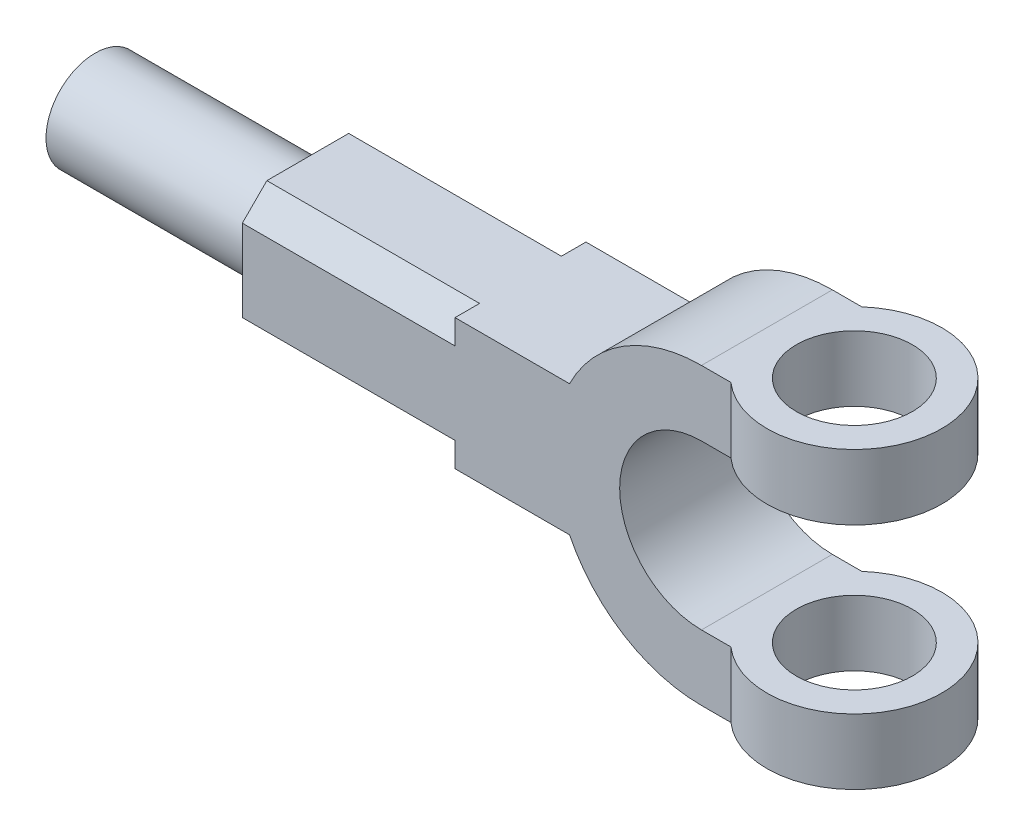
ISO-10303-21;
HEADER;
FILE_DESCRIPTION(('STEP AP214'),'2;1');
FILE_NAME('part.step','',(''),(''),'','','');
FILE_SCHEMA(('AUTOMOTIVE_DESIGN { 1 0 10303 214 1 1 1 1 }'));
ENDSEC;
DATA;
#1=APPLICATION_CONTEXT('core data for automotive mechanical design processes');
#2=APPLICATION_PROTOCOL_DEFINITION('international standard','automotive_design',2000,#1);
#3=PRODUCT_CONTEXT('',#1,'mechanical');
#4=PRODUCT('Part','Part','',(#3));
#5=PRODUCT_RELATED_PRODUCT_CATEGORY('part','',(#4));
#6=PRODUCT_DEFINITION_FORMATION('','',#4);
#7=PRODUCT_DEFINITION_CONTEXT('part definition',#1,'design');
#8=PRODUCT_DEFINITION('design','',#6,#7);
#9=PRODUCT_DEFINITION_SHAPE('','',#8);
#10=(LENGTH_UNIT() NAMED_UNIT(*) SI_UNIT(.MILLI.,.METRE.));
#11=(NAMED_UNIT(*) PLANE_ANGLE_UNIT() SI_UNIT($,.RADIAN.));
#12=(NAMED_UNIT(*) SI_UNIT($,.STERADIAN.) SOLID_ANGLE_UNIT());
#13=UNCERTAINTY_MEASURE_WITH_UNIT(LENGTH_MEASURE(1.E-05),#10,'distance_accuracy_value','');
#14=(GEOMETRIC_REPRESENTATION_CONTEXT(3) GLOBAL_UNCERTAINTY_ASSIGNED_CONTEXT((#13)) GLOBAL_UNIT_ASSIGNED_CONTEXT((#10,
#11,#12)) REPRESENTATION_CONTEXT('',''));
#15=CARTESIAN_POINT('',(0.,0.,0.));
#16=DIRECTION('',(0.,0.,1.));
#17=DIRECTION('',(1.,0.,0.));
#18=AXIS2_PLACEMENT_3D('',#15,#16,#17);
#19=CARTESIAN_POINT('',(-140.311288741493,0.,20.));
#20=DIRECTION('',(1.,0.,0.));
#21=DIRECTION('',(0.,0.,-1.));
#22=AXIS2_PLACEMENT_3D('',#19,#20,#21);
#23=PLANE('',#22);
#24=DIRECTION('',(0.,-1.,0.));
#25=VECTOR('',#24,1.);
#26=CARTESIAN_POINT('',(-140.311288741493,0.,-20.));
#27=LINE('',#26,#25);
#28=CARTESIAN_POINT('',(-140.311288741493,12.5,-20.));
#29=VERTEX_POINT('',#28);
#30=CARTESIAN_POINT('',(-140.311288741493,-12.4999999999998,-20.0000000000002));
#31=VERTEX_POINT('',#30);
#32=EDGE_CURVE('E318',#29,#31,#27,.T.);
#33=ORIENTED_EDGE('',*,*,#32,.T.);
#34=DIRECTION('',(0.,0.707106781186552,-0.707106781186543));
#35=VECTOR('',#34,1.);
#36=CARTESIAN_POINT('',(-140.311288741493,-12.4999999999998,-20.0000000000002));
#37=LINE('',#36,#35);
#38=CARTESIAN_POINT('',(-140.311288741493,-19.9999999999999,-12.5000000000002));
#39=VERTEX_POINT('',#38);
#40=EDGE_CURVE('E202',#39,#31,#37,.T.);
#41=ORIENTED_EDGE('',*,*,#40,.F.);
#42=DIRECTION('',(0.,0.,-1.));
#43=VECTOR('',#42,1.);
#44=CARTESIAN_POINT('',(-140.311288741493,-20.,20.));
#45=LINE('',#44,#43);
#46=CARTESIAN_POINT('',(-140.311288741493,-20.,12.5));
#47=VERTEX_POINT('',#46);
#48=EDGE_CURVE('E207',#47,#39,#45,.T.);
#49=ORIENTED_EDGE('',*,*,#48,.F.);
#50=DIRECTION('',(0.,-0.70710678118655,-0.707106781186545));
#51=VECTOR('',#50,1.);
#52=CARTESIAN_POINT('',(-140.311288741493,-20.,12.5));
#53=LINE('',#52,#51);
#54=CARTESIAN_POINT('',(-140.311288741493,-12.5,20.));
#55=VERTEX_POINT('',#54);
#56=EDGE_CURVE('E213',#55,#47,#53,.T.);
#57=ORIENTED_EDGE('',*,*,#56,.F.);
#58=DIRECTION('',(0.,-1.,0.));
#59=VECTOR('',#58,1.);
#60=CARTESIAN_POINT('',(-140.311288741493,0.,20.));
#61=LINE('',#60,#59);
#62=CARTESIAN_POINT('',(-140.311288741493,12.4999999999999,20.0000000000001));
#63=VERTEX_POINT('',#62);
#64=EDGE_CURVE('E350',#63,#55,#61,.T.);
#65=ORIENTED_EDGE('',*,*,#64,.F.);
#66=DIRECTION('',(0.,-0.707106781186547,0.707106781186548));
#67=VECTOR('',#66,1.);
#68=CARTESIAN_POINT('',(-140.311288741493,12.4999999999999,20.0000000000001));
#69=LINE('',#68,#67);
#70=CARTESIAN_POINT('',(-140.311288741493,20.,12.5));
#71=VERTEX_POINT('',#70);
#72=EDGE_CURVE('E232',#71,#63,#69,.T.);
#73=ORIENTED_EDGE('',*,*,#72,.F.);
#74=DIRECTION('',(0.,0.,-1.));
#75=VECTOR('',#74,1.);
#76=CARTESIAN_POINT('',(-140.311288741493,20.,20.));
#77=LINE('',#76,#75);
#78=CARTESIAN_POINT('',(-140.311288741493,20.,-12.5));
#79=VERTEX_POINT('',#78);
#80=EDGE_CURVE('E398',#71,#79,#77,.T.);
#81=ORIENTED_EDGE('',*,*,#80,.T.);
#82=DIRECTION('',(0.,0.70710678118655,0.707106781186545));
#83=VECTOR('',#82,1.);
#84=CARTESIAN_POINT('',(-140.311288741493,20.,-12.5));
#85=LINE('',#84,#83);
#86=EDGE_CURVE('E258',#29,#79,#85,.T.);
#87=ORIENTED_EDGE('',*,*,#86,.F.);
#88=EDGE_LOOP('',(#33,#41,#49,#57,#65,#73,#81,#87));
#89=FACE_BOUND('',#88,.T.);
#90=CARTESIAN_POINT('',(-140.311288741493,0.,0.));
#91=DIRECTION('',(1.,0.,0.));
#92=DIRECTION('',(0.,0.,-1.));
#93=AXIS2_PLACEMENT_3D('',#90,#91,#92);
#94=CIRCLE('',#93,15.);
#95=CARTESIAN_POINT('',(-140.311288741493,0.,-15.));
#96=VERTEX_POINT('',#95);
#97=EDGE_CURVE('E11',#96,#96,#94,.F.);
#98=ORIENTED_EDGE('',*,*,#97,.F.);
#99=EDGE_LOOP('',(#98));
#100=FACE_BOUND('',#99,.T.);
#101=ADVANCED_FACE('F47',(#89,#100),#23,.F.);
#102=CARTESIAN_POINT('',(0.,-20.,20.));
#103=DIRECTION('',(0.,-1.,0.));
#104=DIRECTION('',(1.,0.,0.));
#105=AXIS2_PLACEMENT_3D('',#102,#103,#104);
#106=PLANE('',#105);
#107=DIRECTION('',(-1.,0.,0.));
#108=VECTOR('',#107,1.);
#109=CARTESIAN_POINT('',(-75.3112887414927,-19.9999999999999,-12.5000000000002));
#110=LINE('',#109,#108);
#111=CARTESIAN_POINT('',(-75.3112887414927,-19.9999999999999,-12.5000000000002));
#112=VERTEX_POINT('',#111);
#113=EDGE_CURVE('E187',#112,#39,#110,.T.);
#114=ORIENTED_EDGE('',*,*,#113,.F.);
#115=DIRECTION('',(0.,0.,1.));
#116=VECTOR('',#115,1.);
#117=CARTESIAN_POINT('',(-75.3112887414927,-19.9999999999998,-20.0000000000002));
#118=LINE('',#117,#116);
#119=CARTESIAN_POINT('',(-75.3112887414927,-19.9999999999998,-20.0000000000002));
#120=VERTEX_POINT('',#119);
#121=EDGE_CURVE('E194',#120,#112,#118,.T.);
#122=ORIENTED_EDGE('',*,*,#121,.F.);
#123=DIRECTION('',(-1.,0.,0.));
#124=VECTOR('',#123,1.);
#125=CARTESIAN_POINT('',(0.,-20.,-20.));
#126=LINE('',#125,#124);
#127=CARTESIAN_POINT('',(-40.3112887414927,-20.,-20.));
#128=VERTEX_POINT('',#127);
#129=EDGE_CURVE('E309',#128,#120,#126,.T.);
#130=ORIENTED_EDGE('',*,*,#129,.F.);
#131=DIRECTION('',(0.,0.,-1.));
#132=VECTOR('',#131,1.);
#133=CARTESIAN_POINT('',(-40.3112887414927,-20.,20.));
#134=LINE('',#133,#132);
#135=CARTESIAN_POINT('',(-40.3112887414927,-20.,20.));
#136=VERTEX_POINT('',#135);
#137=EDGE_CURVE('E56',#136,#128,#134,.T.);
#138=ORIENTED_EDGE('',*,*,#137,.F.);
#139=DIRECTION('',(-1.,0.,0.));
#140=VECTOR('',#139,1.);
#141=CARTESIAN_POINT('',(0.,-20.,20.));
#142=LINE('',#141,#140);
#143=CARTESIAN_POINT('',(-75.3112887414927,-20.,20.));
#144=VERTEX_POINT('',#143);
#145=EDGE_CURVE('E313',#136,#144,#142,.T.);
#146=ORIENTED_EDGE('',*,*,#145,.T.);
#147=DIRECTION('',(0.,0.,1.));
#148=VECTOR('',#147,1.);
#149=CARTESIAN_POINT('',(-75.3112887414927,-20.,12.5));
#150=LINE('',#149,#148);
#151=CARTESIAN_POINT('',(-75.3112887414927,-20.,12.5));
#152=VERTEX_POINT('',#151);
#153=EDGE_CURVE('E71',#152,#144,#150,.T.);
#154=ORIENTED_EDGE('',*,*,#153,.F.);
#155=DIRECTION('',(-1.,0.,0.));
#156=VECTOR('',#155,1.);
#157=CARTESIAN_POINT('',(-75.3112887414927,-20.,12.5));
#158=LINE('',#157,#156);
#159=EDGE_CURVE('E229',#152,#47,#158,.T.);
#160=ORIENTED_EDGE('',*,*,#159,.T.);
#161=ORIENTED_EDGE('',*,*,#48,.T.);
#162=EDGE_LOOP('',(#114,#122,#130,#138,#146,#154,#160,#161));
#163=FACE_BOUND('',#162,.T.);
#164=ADVANCED_FACE('F49',(#163),#106,.T.);
#165=CARTESIAN_POINT('',(0.,0.,20.));
#166=DIRECTION('',(0.,0.,-1.));
#167=DIRECTION('',(-1.,0.,0.));
#168=AXIS2_PLACEMENT_3D('',#165,#166,#167);
#169=CYLINDRICAL_SURFACE('',#168,45.);
#170=CARTESIAN_POINT('',(0.,0.,-20.));
#171=DIRECTION('',(0.,0.,1.));
#172=DIRECTION('',(1.,0.,0.));
#173=AXIS2_PLACEMENT_3D('',#170,#171,#172);
#174=CIRCLE('',#173,45.);
#175=CARTESIAN_POINT('',(0.,-45.,-20.));
#176=VERTEX_POINT('',#175);
#177=EDGE_CURVE('E356',#128,#176,#174,.T.);
#178=ORIENTED_EDGE('',*,*,#177,.T.);
#179=DIRECTION('',(0.,0.,-1.));
#180=VECTOR('',#179,1.);
#181=CARTESIAN_POINT('',(0.,-45.,20.));
#182=LINE('',#181,#180);
#183=CARTESIAN_POINT('',(0.,-45.,20.));
#184=VERTEX_POINT('',#183);
#185=EDGE_CURVE('E414',#184,#176,#182,.T.);
#186=ORIENTED_EDGE('',*,*,#185,.F.);
#187=CARTESIAN_POINT('',(0.,0.,20.));
#188=DIRECTION('',(0.,0.,1.));
#189=DIRECTION('',(1.,0.,0.));
#190=AXIS2_PLACEMENT_3D('',#187,#188,#189);
#191=CIRCLE('',#190,45.);
#192=EDGE_CURVE('E317',#136,#184,#191,.T.);
#193=ORIENTED_EDGE('',*,*,#192,.F.);
#194=ORIENTED_EDGE('',*,*,#137,.T.);
#195=EDGE_LOOP('',(#178,#186,#193,#194));
#196=FACE_BOUND('',#195,.T.);
#197=ADVANCED_FACE('F421',(#196),#169,.T.);
#198=CARTESIAN_POINT('',(0.,-45.,20.));
#199=DIRECTION('',(0.,1.,0.));
#200=DIRECTION('',(0.,0.,1.));
#201=AXIS2_PLACEMENT_3D('',#198,#199,#200);
#202=PLANE('',#201);
#203=CARTESIAN_POINT('',(26.7222222222222,-45.,0.));
#204=DIRECTION('',(0.,1.,0.));
#205=DIRECTION('',(0.,0.,1.));
#206=AXIS2_PLACEMENT_3D('',#203,#204,#205);
#207=CIRCLE('',#206,17.7222222222222);
#208=CARTESIAN_POINT('',(26.7222222222222,-45.,17.7222222222222));
#209=VERTEX_POINT('',#208);
#210=EDGE_CURVE('E278',#209,#209,#207,.T.);
#211=ORIENTED_EDGE('',*,*,#210,.T.);
#212=EDGE_LOOP('',(#211));
#213=FACE_BOUND('',#212,.T.);
#214=CARTESIAN_POINT('',(26.7222222222222,-45.,0.));
#215=DIRECTION('',(0.,1.,0.));
#216=DIRECTION('',(0.,0.,1.));
#217=AXIS2_PLACEMENT_3D('',#214,#215,#216);
#218=CIRCLE('',#217,26.7222222222222);
#219=CARTESIAN_POINT('',(8.99999999999999,-45.,20.));
#220=VERTEX_POINT('',#219);
#221=CARTESIAN_POINT('',(8.99999999999999,-45.,-20.));
#222=VERTEX_POINT('',#221);
#223=EDGE_CURVE('E285',#220,#222,#218,.T.);
#224=ORIENTED_EDGE('',*,*,#223,.F.);
#225=DIRECTION('',(1.,0.,0.));
#226=VECTOR('',#225,1.);
#227=CARTESIAN_POINT('',(0.,-45.,20.));
#228=LINE('',#227,#226);
#229=EDGE_CURVE('E321',#184,#220,#228,.T.);
#230=ORIENTED_EDGE('',*,*,#229,.F.);
#231=ORIENTED_EDGE('',*,*,#185,.T.);
#232=DIRECTION('',(1.,0.,0.));
#233=VECTOR('',#232,1.);
#234=CARTESIAN_POINT('',(0.,-45.,-20.));
#235=LINE('',#234,#233);
#236=EDGE_CURVE('E360',#176,#222,#235,.T.);
#237=ORIENTED_EDGE('',*,*,#236,.T.);
#238=EDGE_LOOP('',(#224,#230,#231,#237));
#239=FACE_BOUND('',#238,.T.);
#240=ADVANCED_FACE('F430',(#213,#239),#202,.F.);
#241=CARTESIAN_POINT('',(0.,-25.,20.));
#242=DIRECTION('',(0.,-1.,0.));
#243=DIRECTION('',(0.,0.,-1.));
#244=AXIS2_PLACEMENT_3D('',#241,#242,#243);
#245=PLANE('',#244);
#246=CARTESIAN_POINT('',(26.7222222222222,-25.,0.));
#247=DIRECTION('',(0.,1.,0.));
#248=DIRECTION('',(0.,0.,1.));
#249=AXIS2_PLACEMENT_3D('',#246,#247,#248);
#250=CIRCLE('',#249,17.7222222222222);
#251=CARTESIAN_POINT('',(26.7222222222222,-25.,17.7222222222222));
#252=VERTEX_POINT('',#251);
#253=EDGE_CURVE('E281',#252,#252,#250,.T.);
#254=ORIENTED_EDGE('',*,*,#253,.F.);
#255=EDGE_LOOP('',(#254));
#256=FACE_BOUND('',#255,.T.);
#257=CARTESIAN_POINT('',(26.7222222222222,-25.,0.));
#258=DIRECTION('',(0.,1.,0.));
#259=DIRECTION('',(0.,0.,1.));
#260=AXIS2_PLACEMENT_3D('',#257,#258,#259);
#261=CIRCLE('',#260,26.7222222222222);
#262=CARTESIAN_POINT('',(8.99999999999999,-25.,20.));
#263=VERTEX_POINT('',#262);
#264=CARTESIAN_POINT('',(9.00000000000001,-25.,-20.));
#265=VERTEX_POINT('',#264);
#266=EDGE_CURVE('E289',#263,#265,#261,.T.);
#267=ORIENTED_EDGE('',*,*,#266,.T.);
#268=DIRECTION('',(-1.,0.,0.));
#269=VECTOR('',#268,1.);
#270=CARTESIAN_POINT('',(0.,-25.,-20.));
#271=LINE('',#270,#269);
#272=CARTESIAN_POINT('',(0.,-25.,-20.));
#273=VERTEX_POINT('',#272);
#274=EDGE_CURVE('E367',#265,#273,#271,.T.);
#275=ORIENTED_EDGE('',*,*,#274,.T.);
#276=DIRECTION('',(0.,0.,-1.));
#277=VECTOR('',#276,1.);
#278=CARTESIAN_POINT('',(0.,-25.,20.));
#279=LINE('',#278,#277);
#280=CARTESIAN_POINT('',(0.,-25.,20.));
#281=VERTEX_POINT('',#280);
#282=EDGE_CURVE('E411',#281,#273,#279,.T.);
#283=ORIENTED_EDGE('',*,*,#282,.F.);
#284=DIRECTION('',(-1.,0.,0.));
#285=VECTOR('',#284,1.);
#286=CARTESIAN_POINT('',(0.,-25.,20.));
#287=LINE('',#286,#285);
#288=EDGE_CURVE('E327',#263,#281,#287,.T.);
#289=ORIENTED_EDGE('',*,*,#288,.F.);
#290=EDGE_LOOP('',(#267,#275,#283,#289));
#291=FACE_BOUND('',#290,.T.);
#292=ADVANCED_FACE('F441',(#256,#291),#245,.F.);
#293=CARTESIAN_POINT('',(0.,0.,20.));
#294=DIRECTION('',(0.,0.,-1.));
#295=DIRECTION('',(-1.,0.,0.));
#296=AXIS2_PLACEMENT_3D('',#293,#294,#295);
#297=CYLINDRICAL_SURFACE('',#296,25.);
#298=CARTESIAN_POINT('',(0.,0.,-20.));
#299=DIRECTION('',(0.,0.,1.));
#300=DIRECTION('',(1.,0.,0.));
#301=AXIS2_PLACEMENT_3D('',#298,#299,#300);
#302=CIRCLE('',#301,25.);
#303=CARTESIAN_POINT('',(0.,25.,-20.));
#304=VERTEX_POINT('',#303);
#305=EDGE_CURVE('E371',#304,#273,#302,.T.);
#306=ORIENTED_EDGE('',*,*,#305,.F.);
#307=DIRECTION('',(0.,0.,-1.));
#308=VECTOR('',#307,1.);
#309=CARTESIAN_POINT('',(0.,25.,20.));
#310=LINE('',#309,#308);
#311=CARTESIAN_POINT('',(0.,25.,20.));
#312=VERTEX_POINT('',#311);
#313=EDGE_CURVE('E408',#312,#304,#310,.T.);
#314=ORIENTED_EDGE('',*,*,#313,.F.);
#315=CARTESIAN_POINT('',(0.,0.,20.));
#316=DIRECTION('',(0.,0.,1.));
#317=DIRECTION('',(1.,0.,0.));
#318=AXIS2_PLACEMENT_3D('',#315,#316,#317);
#319=CIRCLE('',#318,25.);
#320=EDGE_CURVE('E330',#312,#281,#319,.T.);
#321=ORIENTED_EDGE('',*,*,#320,.T.);
#322=ORIENTED_EDGE('',*,*,#282,.T.);
#323=EDGE_LOOP('',(#306,#314,#321,#322));
#324=FACE_BOUND('',#323,.T.);
#325=ADVANCED_FACE('F448',(#324),#297,.F.);
#326=CARTESIAN_POINT('',(0.,25.,20.));
#327=DIRECTION('',(0.,1.,0.));
#328=DIRECTION('',(0.,0.,1.));
#329=AXIS2_PLACEMENT_3D('',#326,#327,#328);
#330=PLANE('',#329);
#331=ORIENTED_EDGE('',*,*,#313,.T.);
#332=DIRECTION('',(1.,0.,0.));
#333=VECTOR('',#332,1.);
#334=CARTESIAN_POINT('',(0.,25.,-20.));
#335=LINE('',#334,#333);
#336=CARTESIAN_POINT('',(8.99999999999999,25.,-20.));
#337=VERTEX_POINT('',#336);
#338=EDGE_CURVE('E375',#304,#337,#335,.T.);
#339=ORIENTED_EDGE('',*,*,#338,.T.);
#340=CARTESIAN_POINT('',(26.7222222222222,25.,0.));
#341=DIRECTION('',(0.,1.,0.));
#342=DIRECTION('',(0.,0.,1.));
#343=AXIS2_PLACEMENT_3D('',#340,#341,#342);
#344=CIRCLE('',#343,26.7222222222222);
#345=CARTESIAN_POINT('',(8.99999999999999,25.,20.));
#346=VERTEX_POINT('',#345);
#347=EDGE_CURVE('E305',#346,#337,#344,.T.);
#348=ORIENTED_EDGE('',*,*,#347,.F.);
#349=DIRECTION('',(1.,0.,0.));
#350=VECTOR('',#349,1.);
#351=CARTESIAN_POINT('',(0.,25.,20.));
#352=LINE('',#351,#350);
#353=EDGE_CURVE('E334',#312,#346,#352,.T.);
#354=ORIENTED_EDGE('',*,*,#353,.F.);
#355=EDGE_LOOP('',(#331,#339,#348,#354));
#356=FACE_BOUND('',#355,.T.);
#357=CARTESIAN_POINT('',(26.7222222222222,25.,0.));
#358=DIRECTION('',(0.,1.,0.));
#359=DIRECTION('',(0.,0.,1.));
#360=AXIS2_PLACEMENT_3D('',#357,#358,#359);
#361=CIRCLE('',#360,17.7222222222222);
#362=CARTESIAN_POINT('',(26.7222222222222,25.,17.7222222222222));
#363=VERTEX_POINT('',#362);
#364=EDGE_CURVE('E297',#363,#363,#361,.T.);
#365=ORIENTED_EDGE('',*,*,#364,.T.);
#366=EDGE_LOOP('',(#365));
#367=FACE_BOUND('',#366,.T.);
#368=ADVANCED_FACE('F452',(#356,#367),#330,.F.);
#369=CARTESIAN_POINT('',(0.,45.,20.));
#370=DIRECTION('',(0.,-1.,0.));
#371=DIRECTION('',(0.,0.,-1.));
#372=AXIS2_PLACEMENT_3D('',#369,#370,#371);
#373=PLANE('',#372);
#374=CARTESIAN_POINT('',(26.7222222222222,45.,0.));
#375=DIRECTION('',(0.,1.,0.));
#376=DIRECTION('',(0.,0.,1.));
#377=AXIS2_PLACEMENT_3D('',#374,#375,#376);
#378=CIRCLE('',#377,17.7222222222222);
#379=CARTESIAN_POINT('',(26.7222222222222,45.,17.7222222222222));
#380=VERTEX_POINT('',#379);
#381=EDGE_CURVE('E293',#380,#380,#378,.T.);
#382=ORIENTED_EDGE('',*,*,#381,.F.);
#383=EDGE_LOOP('',(#382));
#384=FACE_BOUND('',#383,.T.);
#385=DIRECTION('',(-1.,0.,0.));
#386=VECTOR('',#385,1.);
#387=CARTESIAN_POINT('',(0.,45.,-20.));
#388=LINE('',#387,#386);
#389=CARTESIAN_POINT('',(9.00000000000001,45.,-20.));
#390=VERTEX_POINT('',#389);
#391=CARTESIAN_POINT('',(0.,45.,-20.));
#392=VERTEX_POINT('',#391);
#393=EDGE_CURVE('E382',#390,#392,#388,.T.);
#394=ORIENTED_EDGE('',*,*,#393,.T.);
#395=DIRECTION('',(0.,0.,-1.));
#396=VECTOR('',#395,1.);
#397=CARTESIAN_POINT('',(0.,45.,20.));
#398=LINE('',#397,#396);
#399=CARTESIAN_POINT('',(0.,45.,20.));
#400=VERTEX_POINT('',#399);
#401=EDGE_CURVE('E405',#400,#392,#398,.T.);
#402=ORIENTED_EDGE('',*,*,#401,.F.);
#403=DIRECTION('',(-1.,0.,0.));
#404=VECTOR('',#403,1.);
#405=CARTESIAN_POINT('',(0.,45.,20.));
#406=LINE('',#405,#404);
#407=CARTESIAN_POINT('',(8.99999999999999,45.,20.));
#408=VERTEX_POINT('',#407);
#409=EDGE_CURVE('E340',#408,#400,#406,.T.);
#410=ORIENTED_EDGE('',*,*,#409,.F.);
#411=CARTESIAN_POINT('',(26.7222222222222,45.,0.));
#412=DIRECTION('',(0.,1.,0.));
#413=DIRECTION('',(0.,0.,1.));
#414=AXIS2_PLACEMENT_3D('',#411,#412,#413);
#415=CIRCLE('',#414,26.7222222222222);
#416=EDGE_CURVE('E301',#408,#390,#415,.T.);
#417=ORIENTED_EDGE('',*,*,#416,.T.);
#418=EDGE_LOOP('',(#394,#402,#410,#417));
#419=FACE_BOUND('',#418,.T.);
#420=ADVANCED_FACE('F461',(#384,#419),#373,.F.);
#421=CARTESIAN_POINT('',(0.,0.,20.));
#422=DIRECTION('',(0.,0.,-1.));
#423=DIRECTION('',(-1.,0.,0.));
#424=AXIS2_PLACEMENT_3D('',#421,#422,#423);
#425=CYLINDRICAL_SURFACE('',#424,45.);
#426=CARTESIAN_POINT('',(0.,0.,-20.));
#427=DIRECTION('',(0.,0.,1.));
#428=DIRECTION('',(1.,0.,0.));
#429=AXIS2_PLACEMENT_3D('',#426,#427,#428);
#430=CIRCLE('',#429,45.);
#431=CARTESIAN_POINT('',(-40.3112887414927,20.,-20.));
#432=VERTEX_POINT('',#431);
#433=EDGE_CURVE('E386',#392,#432,#430,.T.);
#434=ORIENTED_EDGE('',*,*,#433,.T.);
#435=DIRECTION('',(0.,0.,-1.));
#436=VECTOR('',#435,1.);
#437=CARTESIAN_POINT('',(-40.3112887414927,20.,20.));
#438=LINE('',#437,#436);
#439=CARTESIAN_POINT('',(-40.3112887414927,20.,20.));
#440=VERTEX_POINT('',#439);
#441=EDGE_CURVE('E401',#440,#432,#438,.T.);
#442=ORIENTED_EDGE('',*,*,#441,.F.);
#443=CARTESIAN_POINT('',(0.,0.,20.));
#444=DIRECTION('',(0.,0.,1.));
#445=DIRECTION('',(1.,0.,0.));
#446=AXIS2_PLACEMENT_3D('',#443,#444,#445);
#447=CIRCLE('',#446,45.);
#448=EDGE_CURVE('E343',#400,#440,#447,.T.);
#449=ORIENTED_EDGE('',*,*,#448,.F.);
#450=ORIENTED_EDGE('',*,*,#401,.T.);
#451=EDGE_LOOP('',(#434,#442,#449,#450));
#452=FACE_BOUND('',#451,.T.);
#453=ADVANCED_FACE('F466',(#452),#425,.T.);
#454=CARTESIAN_POINT('',(0.,20.,20.));
#455=DIRECTION('',(0.,-1.,0.));
#456=DIRECTION('',(1.,0.,0.));
#457=AXIS2_PLACEMENT_3D('',#454,#455,#456);
#458=PLANE('',#457);
#459=ORIENTED_EDGE('',*,*,#80,.F.);
#460=DIRECTION('',(-1.,0.,0.));
#461=VECTOR('',#460,1.);
#462=CARTESIAN_POINT('',(-75.3112887414927,20.,12.5));
#463=LINE('',#462,#461);
#464=CARTESIAN_POINT('',(-75.3112887414927,20.,12.5));
#465=VERTEX_POINT('',#464);
#466=EDGE_CURVE('E245',#465,#71,#463,.T.);
#467=ORIENTED_EDGE('',*,*,#466,.F.);
#468=DIRECTION('',(0.,0.,-1.));
#469=VECTOR('',#468,1.);
#470=CARTESIAN_POINT('',(-75.3112887414927,19.9999999999999,20.0000000000001));
#471=LINE('',#470,#469);
#472=CARTESIAN_POINT('',(-75.3112887414927,19.9999999999999,20.0000000000001));
#473=VERTEX_POINT('',#472);
#474=EDGE_CURVE('E235',#473,#465,#471,.T.);
#475=ORIENTED_EDGE('',*,*,#474,.F.);
#476=DIRECTION('',(-1.,0.,0.));
#477=VECTOR('',#476,1.);
#478=CARTESIAN_POINT('',(0.,20.,20.));
#479=LINE('',#478,#477);
#480=EDGE_CURVE('E346',#440,#473,#479,.T.);
#481=ORIENTED_EDGE('',*,*,#480,.F.);
#482=ORIENTED_EDGE('',*,*,#441,.T.);
#483=DIRECTION('',(-1.,0.,0.));
#484=VECTOR('',#483,1.);
#485=CARTESIAN_POINT('',(0.,20.,-20.));
#486=LINE('',#485,#484);
#487=CARTESIAN_POINT('',(-75.3112887414927,20.,-20.));
#488=VERTEX_POINT('',#487);
#489=EDGE_CURVE('E389',#432,#488,#486,.T.);
#490=ORIENTED_EDGE('',*,*,#489,.T.);
#491=DIRECTION('',(0.,0.,-1.));
#492=VECTOR('',#491,1.);
#493=CARTESIAN_POINT('',(-75.3112887414927,20.,-12.5));
#494=LINE('',#493,#492);
#495=CARTESIAN_POINT('',(-75.3112887414927,20.,-12.5));
#496=VERTEX_POINT('',#495);
#497=EDGE_CURVE('E267',#496,#488,#494,.T.);
#498=ORIENTED_EDGE('',*,*,#497,.F.);
#499=DIRECTION('',(-1.,0.,0.));
#500=VECTOR('',#499,1.);
#501=CARTESIAN_POINT('',(-75.3112887414927,20.,-12.5));
#502=LINE('',#501,#500);
#503=EDGE_CURVE('E274',#496,#79,#502,.T.);
#504=ORIENTED_EDGE('',*,*,#503,.T.);
#505=EDGE_LOOP('',(#459,#467,#475,#481,#482,#490,#498,#504));
#506=FACE_BOUND('',#505,.T.);
#507=ADVANCED_FACE('F472',(#506),#458,.F.);
#508=CARTESIAN_POINT('',(0.,0.,20.));
#509=DIRECTION('',(0.,0.,1.));
#510=DIRECTION('',(1.,0.,0.));
#511=AXIS2_PLACEMENT_3D('',#508,#509,#510);
#512=PLANE('',#511);
#513=DIRECTION('',(-1.,0.,0.));
#514=VECTOR('',#513,1.);
#515=CARTESIAN_POINT('',(-75.3112887414927,-12.5,20.));
#516=LINE('',#515,#514);
#517=CARTESIAN_POINT('',(-75.3112887414927,-12.5,20.));
#518=VERTEX_POINT('',#517);
#519=EDGE_CURVE('E226',#518,#55,#516,.T.);
#520=ORIENTED_EDGE('',*,*,#519,.F.);
#521=DIRECTION('',(0.,1.,0.));
#522=VECTOR('',#521,1.);
#523=CARTESIAN_POINT('',(-75.3112887414927,-20.,20.));
#524=LINE('',#523,#522);
#525=EDGE_CURVE('E218',#144,#518,#524,.T.);
#526=ORIENTED_EDGE('',*,*,#525,.F.);
#527=ORIENTED_EDGE('',*,*,#145,.F.);
#528=ORIENTED_EDGE('',*,*,#192,.T.);
#529=ORIENTED_EDGE('',*,*,#229,.T.);
#530=DIRECTION('',(0.,1.,0.));
#531=VECTOR('',#530,1.);
#532=CARTESIAN_POINT('',(8.99999999999999,0.,20.));
#533=LINE('',#532,#531);
#534=EDGE_CURVE('E324',#220,#263,#533,.T.);
#535=ORIENTED_EDGE('',*,*,#534,.T.);
#536=ORIENTED_EDGE('',*,*,#288,.T.);
#537=ORIENTED_EDGE('',*,*,#320,.F.);
#538=ORIENTED_EDGE('',*,*,#353,.T.);
#539=DIRECTION('',(0.,1.,0.));
#540=VECTOR('',#539,1.);
#541=CARTESIAN_POINT('',(8.99999999999999,0.,20.));
#542=LINE('',#541,#540);
#543=EDGE_CURVE('E337',#346,#408,#542,.T.);
#544=ORIENTED_EDGE('',*,*,#543,.T.);
#545=ORIENTED_EDGE('',*,*,#409,.T.);
#546=ORIENTED_EDGE('',*,*,#448,.T.);
#547=ORIENTED_EDGE('',*,*,#480,.T.);
#548=DIRECTION('',(0.,1.,0.));
#549=VECTOR('',#548,1.);
#550=CARTESIAN_POINT('',(-75.3112887414927,12.4999999999999,20.0000000000001));
#551=LINE('',#550,#549);
#552=CARTESIAN_POINT('',(-75.3112887414927,12.4999999999999,20.));
#553=VERTEX_POINT('',#552);
#554=EDGE_CURVE('E242',#553,#473,#551,.T.);
#555=ORIENTED_EDGE('',*,*,#554,.F.);
#556=DIRECTION('',(-1.,0.,0.));
#557=VECTOR('',#556,1.);
#558=CARTESIAN_POINT('',(-75.3112887414927,12.4999999999999,20.0000000000001));
#559=LINE('',#558,#557);
#560=EDGE_CURVE('E248',#553,#63,#559,.T.);
#561=ORIENTED_EDGE('',*,*,#560,.T.);
#562=ORIENTED_EDGE('',*,*,#64,.T.);
#563=EDGE_LOOP('',(#520,#526,#527,#528,#529,#535,#536,#537,#538,#544,#545,#546,#547,#555,#561,#562));
#564=FACE_BOUND('',#563,.T.);
#565=ADVANCED_FACE('F435',(#564),#512,.T.);
#566=CARTESIAN_POINT('',(0.,0.,-20.));
#567=DIRECTION('',(0.,0.,1.));
#568=DIRECTION('',(1.,0.,0.));
#569=AXIS2_PLACEMENT_3D('',#566,#567,#568);
#570=PLANE('',#569);
#571=DIRECTION('',(0.,-1.,0.));
#572=VECTOR('',#571,1.);
#573=CARTESIAN_POINT('',(-75.3112887414927,-12.4999999999998,-20.0000000000002));
#574=LINE('',#573,#572);
#575=CARTESIAN_POINT('',(-75.3112887414927,-12.4999999999998,-20.));
#576=VERTEX_POINT('',#575);
#577=EDGE_CURVE('E193',#576,#120,#574,.T.);
#578=ORIENTED_EDGE('',*,*,#577,.F.);
#579=DIRECTION('',(-1.,0.,0.));
#580=VECTOR('',#579,1.);
#581=CARTESIAN_POINT('',(-75.3112887414927,-12.4999999999998,-20.0000000000002));
#582=LINE('',#581,#580);
#583=EDGE_CURVE('E190',#576,#31,#582,.T.);
#584=ORIENTED_EDGE('',*,*,#583,.T.);
#585=ORIENTED_EDGE('',*,*,#32,.F.);
#586=DIRECTION('',(-1.,0.,0.));
#587=VECTOR('',#586,1.);
#588=CARTESIAN_POINT('',(-75.3112887414927,12.5,-20.));
#589=LINE('',#588,#587);
#590=CARTESIAN_POINT('',(-75.3112887414927,12.5,-20.));
#591=VERTEX_POINT('',#590);
#592=EDGE_CURVE('E270',#591,#29,#589,.T.);
#593=ORIENTED_EDGE('',*,*,#592,.F.);
#594=DIRECTION('',(0.,-1.,0.));
#595=VECTOR('',#594,1.);
#596=CARTESIAN_POINT('',(-75.3112887414927,20.,-20.));
#597=LINE('',#596,#595);
#598=EDGE_CURVE('E259',#488,#591,#597,.T.);
#599=ORIENTED_EDGE('',*,*,#598,.F.);
#600=ORIENTED_EDGE('',*,*,#489,.F.);
#601=ORIENTED_EDGE('',*,*,#433,.F.);
#602=ORIENTED_EDGE('',*,*,#393,.F.);
#603=DIRECTION('',(0.,1.,0.));
#604=VECTOR('',#603,1.);
#605=CARTESIAN_POINT('',(8.99999999999999,0.,-20.));
#606=LINE('',#605,#604);
#607=EDGE_CURVE('E378',#337,#390,#606,.T.);
#608=ORIENTED_EDGE('',*,*,#607,.F.);
#609=ORIENTED_EDGE('',*,*,#338,.F.);
#610=ORIENTED_EDGE('',*,*,#305,.T.);
#611=ORIENTED_EDGE('',*,*,#274,.F.);
#612=DIRECTION('',(0.,1.,0.));
#613=VECTOR('',#612,1.);
#614=CARTESIAN_POINT('',(8.99999999999999,0.,-20.));
#615=LINE('',#614,#613);
#616=EDGE_CURVE('E363',#222,#265,#615,.T.);
#617=ORIENTED_EDGE('',*,*,#616,.F.);
#618=ORIENTED_EDGE('',*,*,#236,.F.);
#619=ORIENTED_EDGE('',*,*,#177,.F.);
#620=ORIENTED_EDGE('',*,*,#129,.T.);
#621=EDGE_LOOP('',(#578,#584,#585,#593,#599,#600,#601,#602,#608,#609,#610,#611,#617,#618,#619,#620));
#622=FACE_BOUND('',#621,.T.);
#623=ADVANCED_FACE('F426',(#622),#570,.F.);
#624=CARTESIAN_POINT('',(26.7222222222222,25.,0.));
#625=DIRECTION('',(0.,1.,0.));
#626=DIRECTION('',(0.,0.,1.));
#627=AXIS2_PLACEMENT_3D('',#624,#625,#626);
#628=CYLINDRICAL_SURFACE('',#627,26.7222222222222);
#629=ORIENTED_EDGE('',*,*,#416,.F.);
#630=ORIENTED_EDGE('',*,*,#543,.F.);
#631=ORIENTED_EDGE('',*,*,#347,.T.);
#632=ORIENTED_EDGE('',*,*,#607,.T.);
#633=EDGE_LOOP('',(#629,#630,#631,#632));
#634=FACE_BOUND('',#633,.T.);
#635=ADVANCED_FACE('F457',(#634),#628,.T.);
#636=CARTESIAN_POINT('',(26.7222222222222,25.,0.));
#637=DIRECTION('',(0.,1.,0.));
#638=DIRECTION('',(0.,0.,1.));
#639=AXIS2_PLACEMENT_3D('',#636,#637,#638);
#640=CYLINDRICAL_SURFACE('',#639,17.7222222222222);
#641=ORIENTED_EDGE('',*,*,#381,.T.);
#642=EDGE_LOOP('',(#641));
#643=FACE_BOUND('',#642,.T.);
#644=ORIENTED_EDGE('',*,*,#364,.F.);
#645=EDGE_LOOP('',(#644));
#646=FACE_BOUND('',#645,.T.);
#647=ADVANCED_FACE('F569',(#643,#646),#640,.F.);
#648=CARTESIAN_POINT('',(26.7222222222222,-25.,0.));
#649=DIRECTION('',(0.,-1.,0.));
#650=DIRECTION('',(0.,0.,-1.));
#651=AXIS2_PLACEMENT_3D('',#648,#649,#650);
#652=CYLINDRICAL_SURFACE('',#651,26.7222222222222);
#653=ORIENTED_EDGE('',*,*,#534,.F.);
#654=ORIENTED_EDGE('',*,*,#223,.T.);
#655=ORIENTED_EDGE('',*,*,#616,.T.);
#656=ORIENTED_EDGE('',*,*,#266,.F.);
#657=EDGE_LOOP('',(#653,#654,#655,#656));
#658=FACE_BOUND('',#657,.T.);
#659=ADVANCED_FACE('F439',(#658),#652,.T.);
#660=CARTESIAN_POINT('',(26.7222222222222,-25.,0.));
#661=DIRECTION('',(0.,-1.,0.));
#662=DIRECTION('',(0.,0.,-1.));
#663=AXIS2_PLACEMENT_3D('',#660,#661,#662);
#664=CYLINDRICAL_SURFACE('',#663,17.7222222222222);
#665=ORIENTED_EDGE('',*,*,#253,.T.);
#666=EDGE_LOOP('',(#665));
#667=FACE_BOUND('',#666,.T.);
#668=ORIENTED_EDGE('',*,*,#210,.F.);
#669=EDGE_LOOP('',(#668));
#670=FACE_BOUND('',#669,.T.);
#671=ADVANCED_FACE('F583',(#667,#670),#664,.F.);
#672=CARTESIAN_POINT('',(-75.3112887414927,20.,-12.5));
#673=DIRECTION('',(0.,-0.707106781186545,0.70710678118655));
#674=DIRECTION('',(0.,-0.70710678118655,-0.707106781186545));
#675=AXIS2_PLACEMENT_3D('',#672,#673,#674);
#676=PLANE('',#675);
#677=ORIENTED_EDGE('',*,*,#86,.T.);
#678=ORIENTED_EDGE('',*,*,#503,.F.);
#679=DIRECTION('',(0.,0.70710678118655,0.707106781186545));
#680=VECTOR('',#679,1.);
#681=CARTESIAN_POINT('',(-75.3112887414927,20.,-12.5));
#682=LINE('',#681,#680);
#683=EDGE_CURVE('E263',#591,#496,#682,.T.);
#684=ORIENTED_EDGE('',*,*,#683,.F.);
#685=ORIENTED_EDGE('',*,*,#592,.T.);
#686=EDGE_LOOP('',(#677,#678,#684,#685));
#687=FACE_BOUND('',#686,.T.);
#688=ADVANCED_FACE('F590',(#687),#676,.F.);
#689=CARTESIAN_POINT('',(-75.3112887414927,0.,0.));
#690=DIRECTION('',(1.,0.,0.));
#691=DIRECTION('',(0.,0.,-1.));
#692=AXIS2_PLACEMENT_3D('',#689,#690,#691);
#693=PLANE('',#692);
#694=ORIENTED_EDGE('',*,*,#598,.T.);
#695=ORIENTED_EDGE('',*,*,#683,.T.);
#696=ORIENTED_EDGE('',*,*,#497,.T.);
#697=EDGE_LOOP('',(#694,#695,#696));
#698=FACE_BOUND('',#697,.T.);
#699=ADVANCED_FACE('F598',(#698),#693,.F.);
#700=CARTESIAN_POINT('',(-205.311288741493,0.,0.));
#701=DIRECTION('',(1.,0.,0.));
#702=DIRECTION('',(0.,0.,-1.));
#703=AXIS2_PLACEMENT_3D('',#700,#701,#702);
#704=CYLINDRICAL_SURFACE('',#703,15.);
#705=CARTESIAN_POINT('',(-205.311288741493,0.,0.));
#706=DIRECTION('',(-1.,0.,0.));
#707=DIRECTION('',(0.,0.,1.));
#708=AXIS2_PLACEMENT_3D('',#705,#706,#707);
#709=CIRCLE('',#708,15.);
#710=CARTESIAN_POINT('',(-205.311288741493,0.,15.));
#711=VERTEX_POINT('',#710);
#712=EDGE_CURVE('E252',#711,#711,#709,.T.);
#713=ORIENTED_EDGE('',*,*,#712,.F.);
#714=EDGE_LOOP('',(#713));
#715=FACE_BOUND('',#714,.T.);
#716=ORIENTED_EDGE('',*,*,#97,.T.);
#717=EDGE_LOOP('',(#716));
#718=FACE_BOUND('',#717,.T.);
#719=ADVANCED_FACE('F606',(#715,#718),#704,.T.);
#720=CARTESIAN_POINT('',(-205.311288741493,0.,0.));
#721=DIRECTION('',(-1.,0.,0.));
#722=DIRECTION('',(0.,0.,1.));
#723=AXIS2_PLACEMENT_3D('',#720,#721,#722);
#724=PLANE('',#723);
#725=ORIENTED_EDGE('',*,*,#712,.T.);
#726=EDGE_LOOP('',(#725));
#727=FACE_BOUND('',#726,.T.);
#728=ADVANCED_FACE('F614',(#727),#724,.T.);
#729=CARTESIAN_POINT('',(-75.3112887414927,12.4999999999999,20.0000000000001));
#730=DIRECTION('',(0.,-0.707106781186548,-0.707106781186547));
#731=DIRECTION('',(0.,0.707106781186547,-0.707106781186548));
#732=AXIS2_PLACEMENT_3D('',#729,#730,#731);
#733=PLANE('',#732);
#734=ORIENTED_EDGE('',*,*,#72,.T.);
#735=ORIENTED_EDGE('',*,*,#560,.F.);
#736=DIRECTION('',(0.,-0.707106781186547,0.707106781186548));
#737=VECTOR('',#736,1.);
#738=CARTESIAN_POINT('',(-75.3112887414927,12.4999999999999,20.0000000000001));
#739=LINE('',#738,#737);
#740=EDGE_CURVE('E239',#465,#553,#739,.T.);
#741=ORIENTED_EDGE('',*,*,#740,.F.);
#742=ORIENTED_EDGE('',*,*,#466,.T.);
#743=EDGE_LOOP('',(#734,#735,#741,#742));
#744=FACE_BOUND('',#743,.T.);
#745=ADVANCED_FACE('F479',(#744),#733,.F.);
#746=CARTESIAN_POINT('',(-75.3112887414927,0.,0.));
#747=DIRECTION('',(1.,0.,0.));
#748=DIRECTION('',(0.,1.,0.));
#749=AXIS2_PLACEMENT_3D('',#746,#747,#748);
#750=PLANE('',#749);
#751=ORIENTED_EDGE('',*,*,#474,.T.);
#752=ORIENTED_EDGE('',*,*,#740,.T.);
#753=ORIENTED_EDGE('',*,*,#554,.T.);
#754=EDGE_LOOP('',(#751,#752,#753));
#755=FACE_BOUND('',#754,.T.);
#756=ADVANCED_FACE('F476',(#755),#750,.F.);
#757=CARTESIAN_POINT('',(-75.3112887414927,-20.,12.5));
#758=DIRECTION('',(0.,0.707106781186545,-0.70710678118655));
#759=DIRECTION('',(0.,0.70710678118655,0.707106781186545));
#760=AXIS2_PLACEMENT_3D('',#757,#758,#759);
#761=PLANE('',#760);
#762=ORIENTED_EDGE('',*,*,#56,.T.);
#763=ORIENTED_EDGE('',*,*,#159,.F.);
#764=DIRECTION('',(0.,-0.70710678118655,-0.707106781186545));
#765=VECTOR('',#764,1.);
#766=CARTESIAN_POINT('',(-75.3112887414927,-20.,12.5));
#767=LINE('',#766,#765);
#768=EDGE_CURVE('E221',#518,#152,#767,.T.);
#769=ORIENTED_EDGE('',*,*,#768,.F.);
#770=ORIENTED_EDGE('',*,*,#519,.T.);
#771=EDGE_LOOP('',(#762,#763,#769,#770));
#772=FACE_BOUND('',#771,.T.);
#773=ADVANCED_FACE('F486',(#772),#761,.F.);
#774=CARTESIAN_POINT('',(-75.3112887414927,0.,0.));
#775=DIRECTION('',(1.,0.,0.));
#776=DIRECTION('',(0.,0.,1.));
#777=AXIS2_PLACEMENT_3D('',#774,#775,#776);
#778=PLANE('',#777);
#779=ORIENTED_EDGE('',*,*,#525,.T.);
#780=ORIENTED_EDGE('',*,*,#768,.T.);
#781=ORIENTED_EDGE('',*,*,#153,.T.);
#782=EDGE_LOOP('',(#779,#780,#781));
#783=FACE_BOUND('',#782,.T.);
#784=ADVANCED_FACE('F487',(#783),#778,.F.);
#785=CARTESIAN_POINT('',(-75.3112887414927,-12.4999999999998,-20.0000000000002));
#786=DIRECTION('',(0.,0.707106781186543,0.707106781186552));
#787=DIRECTION('',(0.,-0.707106781186552,0.707106781186543));
#788=AXIS2_PLACEMENT_3D('',#785,#786,#787);
#789=PLANE('',#788);
#790=ORIENTED_EDGE('',*,*,#40,.T.);
#791=ORIENTED_EDGE('',*,*,#583,.F.);
#792=DIRECTION('',(0.,0.707106781186552,-0.707106781186543));
#793=VECTOR('',#792,1.);
#794=CARTESIAN_POINT('',(-75.3112887414927,-12.4999999999998,-20.0000000000002));
#795=LINE('',#794,#793);
#796=EDGE_CURVE('E63',#112,#576,#795,.T.);
#797=ORIENTED_EDGE('',*,*,#796,.F.);
#798=ORIENTED_EDGE('',*,*,#113,.T.);
#799=EDGE_LOOP('',(#790,#791,#797,#798));
#800=FACE_BOUND('',#799,.T.);
#801=ADVANCED_FACE('F185',(#800),#789,.F.);
#802=CARTESIAN_POINT('',(-75.3112887414927,0.,0.));
#803=DIRECTION('',(1.,0.,0.));
#804=DIRECTION('',(0.,-1.,0.));
#805=AXIS2_PLACEMENT_3D('',#802,#803,#804);
#806=PLANE('',#805);
#807=ORIENTED_EDGE('',*,*,#121,.T.);
#808=ORIENTED_EDGE('',*,*,#796,.T.);
#809=ORIENTED_EDGE('',*,*,#577,.T.);
#810=EDGE_LOOP('',(#807,#808,#809));
#811=FACE_BOUND('',#810,.T.);
#812=ADVANCED_FACE('F197',(#811),#806,.F.);
#813=CLOSED_SHELL('',(#101,#164,#197,#240,#292,#325,#368,#420,#453,#507,#565,#623,#635,#647,
#659,#671,#688,#699,#719,#728,#745,#756,#773,#784,#801,#812));
#814=MANIFOLD_SOLID_BREP('B2',#813);
#815=ADVANCED_BREP_SHAPE_REPRESENTATION('',(#18,#814),#14);
#816=SHAPE_DEFINITION_REPRESENTATION(#9,#815);
ENDSEC;
END-ISO-10303-21;
